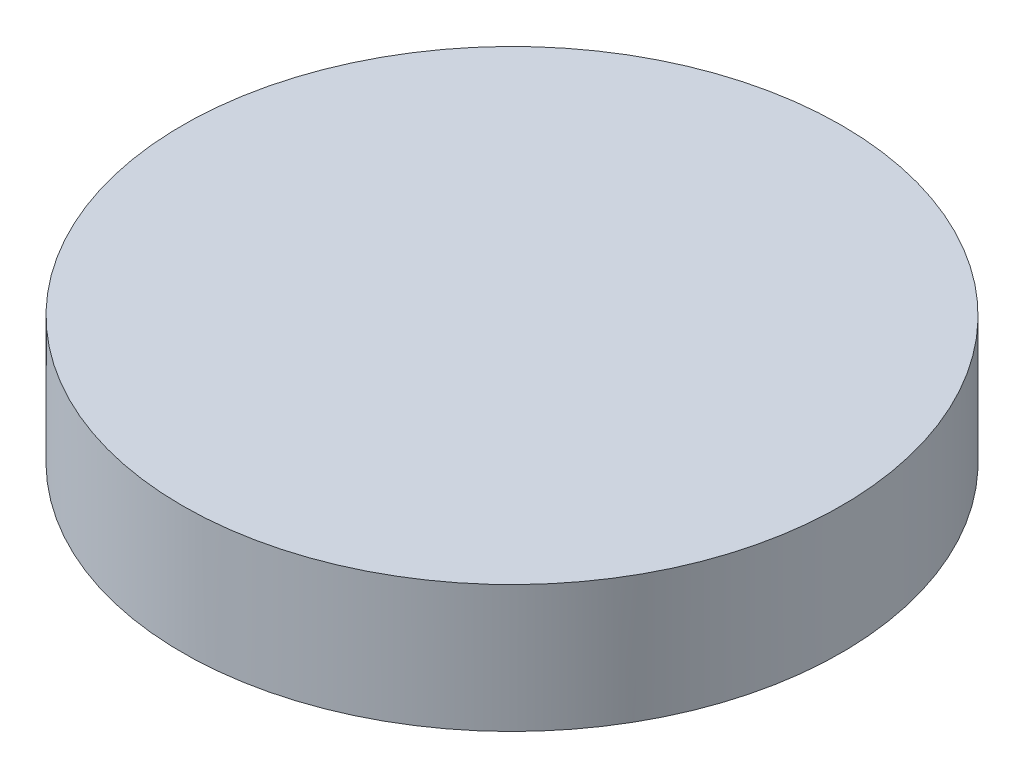
ISO-10303-21;
HEADER;
FILE_DESCRIPTION(('STEP AP214'),'2;1');
FILE_NAME('part.step','',(''),(''),'','','');
FILE_SCHEMA(('AUTOMOTIVE_DESIGN { 1 0 10303 214 1 1 1 1 }'));
ENDSEC;
DATA;
#1=APPLICATION_CONTEXT('core data for automotive mechanical design processes');
#2=APPLICATION_PROTOCOL_DEFINITION('international standard','automotive_design',2000,#1);
#3=PRODUCT_CONTEXT('',#1,'mechanical');
#4=PRODUCT('Part','Part','',(#3));
#5=PRODUCT_RELATED_PRODUCT_CATEGORY('part','',(#4));
#6=PRODUCT_DEFINITION_FORMATION('','',#4);
#7=PRODUCT_DEFINITION_CONTEXT('part definition',#1,'design');
#8=PRODUCT_DEFINITION('design','',#6,#7);
#9=PRODUCT_DEFINITION_SHAPE('','',#8);
#10=(LENGTH_UNIT() NAMED_UNIT(*) SI_UNIT(.MILLI.,.METRE.));
#11=(NAMED_UNIT(*) PLANE_ANGLE_UNIT() SI_UNIT($,.RADIAN.));
#12=(NAMED_UNIT(*) SI_UNIT($,.STERADIAN.) SOLID_ANGLE_UNIT());
#13=UNCERTAINTY_MEASURE_WITH_UNIT(LENGTH_MEASURE(1.E-05),#10,'distance_accuracy_value','');
#14=(GEOMETRIC_REPRESENTATION_CONTEXT(3) GLOBAL_UNCERTAINTY_ASSIGNED_CONTEXT((#13)) GLOBAL_UNIT_ASSIGNED_CONTEXT((#10,
#11,#12)) REPRESENTATION_CONTEXT('',''));
#15=CARTESIAN_POINT('',(0.,0.,0.));
#16=DIRECTION('',(0.,0.,1.));
#17=DIRECTION('',(1.,0.,0.));
#18=AXIS2_PLACEMENT_3D('',#15,#16,#17);
#19=CARTESIAN_POINT('',(0.,7.5,0.));
#20=DIRECTION('',(0.,-1.,0.));
#21=DIRECTION('',(0.,0.,-1.));
#22=AXIS2_PLACEMENT_3D('',#19,#20,#21);
#23=CYLINDRICAL_SURFACE('',#22,31.);
#24=CARTESIAN_POINT('',(0.,7.5,0.));
#25=DIRECTION('',(0.,1.,0.));
#26=DIRECTION('',(0.,0.,1.));
#27=AXIS2_PLACEMENT_3D('',#24,#25,#26);
#28=CIRCLE('',#27,31.);
#29=CARTESIAN_POINT('',(0.,7.5,31.));
#30=VERTEX_POINT('',#29);
#31=EDGE_CURVE('E11',#30,#30,#28,.T.);
#32=ORIENTED_EDGE('',*,*,#31,.F.);
#33=EDGE_LOOP('',(#32));
#34=FACE_BOUND('',#33,.T.);
#35=CARTESIAN_POINT('',(0.,-4.47,0.));
#36=DIRECTION('',(0.,-1.,0.));
#37=DIRECTION('',(0.,0.,-1.));
#38=AXIS2_PLACEMENT_3D('',#35,#36,#37);
#39=CIRCLE('',#38,31.);
#40=CARTESIAN_POINT('',(0.,-4.47,-31.));
#41=VERTEX_POINT('',#40);
#42=EDGE_CURVE('E51',#41,#41,#39,.T.);
#43=ORIENTED_EDGE('',*,*,#42,.F.);
#44=EDGE_LOOP('',(#43));
#45=FACE_BOUND('',#44,.T.);
#46=ADVANCED_FACE('F45',(#34,#45),#23,.T.);
#47=CARTESIAN_POINT('',(0.,7.5,0.));
#48=DIRECTION('',(0.,1.,0.));
#49=DIRECTION('',(0.,0.,1.));
#50=AXIS2_PLACEMENT_3D('',#47,#48,#49);
#51=PLANE('',#50);
#52=ORIENTED_EDGE('',*,*,#31,.T.);
#53=EDGE_LOOP('',(#52));
#54=FACE_BOUND('',#53,.T.);
#55=ADVANCED_FACE('F76',(#54),#51,.T.);
#56=CARTESIAN_POINT('',(0.,-4.47,0.));
#57=DIRECTION('',(0.,-1.,0.));
#58=DIRECTION('',(0.,0.,-1.));
#59=AXIS2_PLACEMENT_3D('',#56,#57,#58);
#60=PLANE('',#59);
#61=ORIENTED_EDGE('',*,*,#42,.T.);
#62=EDGE_LOOP('',(#61));
#63=FACE_BOUND('',#62,.T.);
#64=CARTESIAN_POINT('',(0.,-4.47,0.));
#65=DIRECTION('',(0.,-1.,0.));
#66=DIRECTION('',(0.,0.,-1.));
#67=AXIS2_PLACEMENT_3D('',#64,#65,#66);
#68=CIRCLE('',#67,27.13);
#69=CARTESIAN_POINT('',(0.,-4.47,-27.13));
#70=VERTEX_POINT('',#69);
#71=EDGE_CURVE('E55',#70,#70,#68,.T.);
#72=ORIENTED_EDGE('',*,*,#71,.F.);
#73=EDGE_LOOP('',(#72));
#74=FACE_BOUND('',#73,.T.);
#75=ADVANCED_FACE('F69',(#63,#74),#60,.T.);
#76=CARTESIAN_POINT('',(0.,-4.47,0.));
#77=DIRECTION('',(0.,1.,0.));
#78=DIRECTION('',(0.,0.,1.));
#79=AXIS2_PLACEMENT_3D('',#76,#77,#78);
#80=CYLINDRICAL_SURFACE('',#79,27.13);
#81=ORIENTED_EDGE('',*,*,#71,.T.);
#82=EDGE_LOOP('',(#81));
#83=FACE_BOUND('',#82,.T.);
#84=CARTESIAN_POINT('',(0.,0.,0.));
#85=DIRECTION('',(0.,-1.,0.));
#86=DIRECTION('',(0.,0.,-1.));
#87=AXIS2_PLACEMENT_3D('',#84,#85,#86);
#88=CIRCLE('',#87,27.13);
#89=CARTESIAN_POINT('',(0.,0.,-27.13));
#90=VERTEX_POINT('',#89);
#91=EDGE_CURVE('E59',#90,#90,#88,.T.);
#92=ORIENTED_EDGE('',*,*,#91,.F.);
#93=EDGE_LOOP('',(#92));
#94=FACE_BOUND('',#93,.T.);
#95=ADVANCED_FACE('F67',(#83,#94),#80,.F.);
#96=CARTESIAN_POINT('',(0.,0.,0.));
#97=DIRECTION('',(0.,1.,0.));
#98=DIRECTION('',(0.,0.,1.));
#99=AXIS2_PLACEMENT_3D('',#96,#97,#98);
#100=PLANE('',#99);
#101=ORIENTED_EDGE('',*,*,#91,.T.);
#102=EDGE_LOOP('',(#101));
#103=FACE_BOUND('',#102,.T.);
#104=ADVANCED_FACE('F65',(#103),#100,.F.);
#105=CLOSED_SHELL('',(#46,#55,#75,#95,#104));
#106=MANIFOLD_SOLID_BREP('B2',#105);
#107=ADVANCED_BREP_SHAPE_REPRESENTATION('',(#18,#106),#14);
#108=SHAPE_DEFINITION_REPRESENTATION(#9,#107);
ENDSEC;
END-ISO-10303-21;
